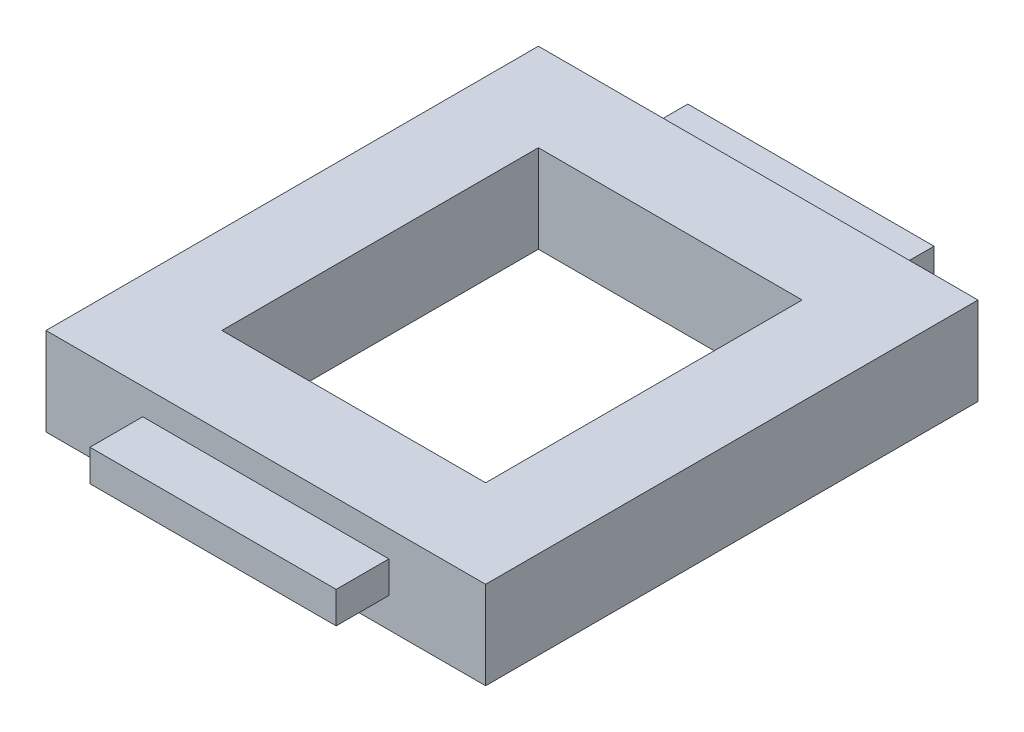
ISO-10303-21;
HEADER;
FILE_DESCRIPTION(('STEP AP214'),'2;1');
FILE_NAME('part.step','',(''),(''),'','','');
FILE_SCHEMA(('AUTOMOTIVE_DESIGN { 1 0 10303 214 1 1 1 1 }'));
ENDSEC;
DATA;
#1=APPLICATION_CONTEXT('core data for automotive mechanical design processes');
#2=APPLICATION_PROTOCOL_DEFINITION('international standard','automotive_design',2000,#1);
#3=PRODUCT_CONTEXT('',#1,'mechanical');
#4=PRODUCT('Part','Part','',(#3));
#5=PRODUCT_RELATED_PRODUCT_CATEGORY('part','',(#4));
#6=PRODUCT_DEFINITION_FORMATION('','',#4);
#7=PRODUCT_DEFINITION_CONTEXT('part definition',#1,'design');
#8=PRODUCT_DEFINITION('design','',#6,#7);
#9=PRODUCT_DEFINITION_SHAPE('','',#8);
#10=(LENGTH_UNIT() NAMED_UNIT(*) SI_UNIT(.MILLI.,.METRE.));
#11=(NAMED_UNIT(*) PLANE_ANGLE_UNIT() SI_UNIT($,.RADIAN.));
#12=(NAMED_UNIT(*) SI_UNIT($,.STERADIAN.) SOLID_ANGLE_UNIT());
#13=UNCERTAINTY_MEASURE_WITH_UNIT(LENGTH_MEASURE(1.E-05),#10,'distance_accuracy_value','');
#14=(GEOMETRIC_REPRESENTATION_CONTEXT(3) GLOBAL_UNCERTAINTY_ASSIGNED_CONTEXT((#13)) GLOBAL_UNIT_ASSIGNED_CONTEXT((#10,
#11,#12)) REPRESENTATION_CONTEXT('',''));
#15=CARTESIAN_POINT('',(0.,0.,0.));
#16=DIRECTION('',(0.,0.,1.));
#17=DIRECTION('',(1.,0.,0.));
#18=AXIS2_PLACEMENT_3D('',#15,#16,#17);
#19=CARTESIAN_POINT('',(0.,5.,-28.));
#20=DIRECTION('',(0.,0.,1.));
#21=DIRECTION('',(1.,0.,0.));
#22=AXIS2_PLACEMENT_3D('',#19,#20,#21);
#23=PLANE('',#22);
#24=DIRECTION('',(-1.,0.,0.));
#25=VECTOR('',#24,1.);
#26=CARTESIAN_POINT('',(0.,0.,-28.));
#27=LINE('',#26,#25);
#28=CARTESIAN_POINT('',(25.,0.,-28.));
#29=VERTEX_POINT('',#28);
#30=CARTESIAN_POINT('',(0.,0.,-28.));
#31=VERTEX_POINT('',#30);
#32=EDGE_CURVE('E240',#29,#31,#27,.T.);
#33=ORIENTED_EDGE('',*,*,#32,.T.);
#34=DIRECTION('',(0.,-1.,0.));
#35=VECTOR('',#34,1.);
#36=CARTESIAN_POINT('',(0.,5.,-28.));
#37=LINE('',#36,#35);
#38=CARTESIAN_POINT('',(0.,5.,-28.));
#39=VERTEX_POINT('',#38);
#40=EDGE_CURVE('E246',#39,#31,#37,.T.);
#41=ORIENTED_EDGE('',*,*,#40,.F.);
#42=DIRECTION('',(-1.,0.,0.));
#43=VECTOR('',#42,1.);
#44=CARTESIAN_POINT('',(0.,5.,-28.));
#45=LINE('',#44,#43);
#46=CARTESIAN_POINT('',(25.,5.,-28.));
#47=VERTEX_POINT('',#46);
#48=EDGE_CURVE('E244',#47,#39,#45,.T.);
#49=ORIENTED_EDGE('',*,*,#48,.F.);
#50=DIRECTION('',(0.,-1.,0.));
#51=VECTOR('',#50,1.);
#52=CARTESIAN_POINT('',(25.,5.,-28.));
#53=LINE('',#52,#51);
#54=EDGE_CURVE('E256',#47,#29,#53,.T.);
#55=ORIENTED_EDGE('',*,*,#54,.T.);
#56=EDGE_LOOP('',(#33,#41,#49,#55));
#57=FACE_BOUND('',#56,.T.);
#58=DIRECTION('',(0.,-1.,0.));
#59=VECTOR('',#58,1.);
#60=CARTESIAN_POINT('',(19.5,3.4,-28.));
#61=LINE('',#60,#59);
#62=CARTESIAN_POINT('',(19.5,3.4,-28.));
#63=VERTEX_POINT('',#62);
#64=CARTESIAN_POINT('',(19.5,1.6,-28.));
#65=VERTEX_POINT('',#64);
#66=EDGE_CURVE('E48',#63,#65,#61,.T.);
#67=ORIENTED_EDGE('',*,*,#66,.F.);
#68=DIRECTION('',(1.,0.,0.));
#69=VECTOR('',#68,1.);
#70=CARTESIAN_POINT('',(19.5,3.4,-28.));
#71=LINE('',#70,#69);
#72=CARTESIAN_POINT('',(5.5,3.4,-28.));
#73=VERTEX_POINT('',#72);
#74=EDGE_CURVE('E52',#73,#63,#71,.T.);
#75=ORIENTED_EDGE('',*,*,#74,.F.);
#76=DIRECTION('',(0.,1.,0.));
#77=VECTOR('',#76,1.);
#78=CARTESIAN_POINT('',(5.5,3.4,-28.));
#79=LINE('',#78,#77);
#80=CARTESIAN_POINT('',(5.5,1.6,-28.));
#81=VERTEX_POINT('',#80);
#82=EDGE_CURVE('E444',#81,#73,#79,.T.);
#83=ORIENTED_EDGE('',*,*,#82,.F.);
#84=DIRECTION('',(-1.,0.,0.));
#85=VECTOR('',#84,1.);
#86=CARTESIAN_POINT('',(19.5,1.6,-28.));
#87=LINE('',#86,#85);
#88=EDGE_CURVE('E450',#65,#81,#87,.T.);
#89=ORIENTED_EDGE('',*,*,#88,.F.);
#90=EDGE_LOOP('',(#67,#75,#83,#89));
#91=FACE_BOUND('',#90,.T.);
#92=ADVANCED_FACE('F33',(#57,#91),#23,.F.);
#93=CARTESIAN_POINT('',(0.,5.,0.));
#94=DIRECTION('',(0.,0.,-1.));
#95=DIRECTION('',(-1.,0.,0.));
#96=AXIS2_PLACEMENT_3D('',#93,#94,#95);
#97=PLANE('',#96);
#98=DIRECTION('',(1.,0.,0.));
#99=VECTOR('',#98,1.);
#100=CARTESIAN_POINT('',(0.,0.,0.));
#101=LINE('',#100,#99);
#102=CARTESIAN_POINT('',(0.,0.,0.));
#103=VERTEX_POINT('',#102);
#104=CARTESIAN_POINT('',(25.,0.,0.));
#105=VERTEX_POINT('',#104);
#106=EDGE_CURVE('E249',#103,#105,#101,.T.);
#107=ORIENTED_EDGE('',*,*,#106,.T.);
#108=DIRECTION('',(0.,-1.,0.));
#109=VECTOR('',#108,1.);
#110=CARTESIAN_POINT('',(25.,5.,0.));
#111=LINE('',#110,#109);
#112=CARTESIAN_POINT('',(25.,5.,0.));
#113=VERTEX_POINT('',#112);
#114=EDGE_CURVE('E41',#113,#105,#111,.T.);
#115=ORIENTED_EDGE('',*,*,#114,.F.);
#116=DIRECTION('',(1.,0.,0.));
#117=VECTOR('',#116,1.);
#118=CARTESIAN_POINT('',(0.,5.,0.));
#119=LINE('',#118,#117);
#120=CARTESIAN_POINT('',(0.,5.,0.));
#121=VERTEX_POINT('',#120);
#122=EDGE_CURVE('E239',#121,#113,#119,.T.);
#123=ORIENTED_EDGE('',*,*,#122,.F.);
#124=DIRECTION('',(0.,-1.,0.));
#125=VECTOR('',#124,1.);
#126=CARTESIAN_POINT('',(0.,5.,0.));
#127=LINE('',#126,#125);
#128=EDGE_CURVE('E11',#121,#103,#127,.T.);
#129=ORIENTED_EDGE('',*,*,#128,.T.);
#130=EDGE_LOOP('',(#107,#115,#123,#129));
#131=FACE_BOUND('',#130,.T.);
#132=DIRECTION('',(0.,-1.,0.));
#133=VECTOR('',#132,1.);
#134=CARTESIAN_POINT('',(5.5,3.5,0.));
#135=LINE('',#134,#133);
#136=CARTESIAN_POINT('',(5.5,3.5,0.));
#137=VERTEX_POINT('',#136);
#138=CARTESIAN_POINT('',(5.5,1.7,0.));
#139=VERTEX_POINT('',#138);
#140=EDGE_CURVE('E166',#137,#139,#135,.T.);
#141=ORIENTED_EDGE('',*,*,#140,.F.);
#142=DIRECTION('',(-1.,0.,0.));
#143=VECTOR('',#142,1.);
#144=CARTESIAN_POINT('',(5.5,3.5,0.));
#145=LINE('',#144,#143);
#146=CARTESIAN_POINT('',(19.5,3.5,0.));
#147=VERTEX_POINT('',#146);
#148=EDGE_CURVE('E179',#147,#137,#145,.T.);
#149=ORIENTED_EDGE('',*,*,#148,.F.);
#150=DIRECTION('',(0.,1.,0.));
#151=VECTOR('',#150,1.);
#152=CARTESIAN_POINT('',(19.5,3.5,0.));
#153=LINE('',#152,#151);
#154=CARTESIAN_POINT('',(19.5,1.7,0.));
#155=VERTEX_POINT('',#154);
#156=EDGE_CURVE('E188',#155,#147,#153,.T.);
#157=ORIENTED_EDGE('',*,*,#156,.F.);
#158=DIRECTION('',(1.,0.,0.));
#159=VECTOR('',#158,1.);
#160=CARTESIAN_POINT('',(5.5,1.7,0.));
#161=LINE('',#160,#159);
#162=EDGE_CURVE('E169',#139,#155,#161,.T.);
#163=ORIENTED_EDGE('',*,*,#162,.F.);
#164=EDGE_LOOP('',(#141,#149,#157,#163));
#165=FACE_BOUND('',#164,.T.);
#166=ADVANCED_FACE('F280',(#131,#165),#97,.F.);
#167=CARTESIAN_POINT('',(0.,5.,0.));
#168=DIRECTION('',(0.,-1.,0.));
#169=DIRECTION('',(0.,0.,-1.));
#170=AXIS2_PLACEMENT_3D('',#167,#168,#169);
#171=PLANE('',#170);
#172=DIRECTION('',(0.,0.,1.));
#173=VECTOR('',#172,1.);
#174=CARTESIAN_POINT('',(0.,5.,0.));
#175=LINE('',#174,#173);
#176=EDGE_CURVE('E236',#39,#121,#175,.T.);
#177=ORIENTED_EDGE('',*,*,#176,.T.);
#178=ORIENTED_EDGE('',*,*,#122,.T.);
#179=DIRECTION('',(0.,0.,-1.));
#180=VECTOR('',#179,1.);
#181=CARTESIAN_POINT('',(25.,5.,0.));
#182=LINE('',#181,#180);
#183=EDGE_CURVE('E242',#113,#47,#182,.T.);
#184=ORIENTED_EDGE('',*,*,#183,.T.);
#185=ORIENTED_EDGE('',*,*,#48,.T.);
#186=EDGE_LOOP('',(#177,#178,#184,#185));
#187=FACE_BOUND('',#186,.T.);
#188=DIRECTION('',(0.,0.,1.));
#189=VECTOR('',#188,1.);
#190=CARTESIAN_POINT('',(5.,5.,-23.));
#191=LINE('',#190,#189);
#192=CARTESIAN_POINT('',(5.,5.,-23.));
#193=VERTEX_POINT('',#192);
#194=CARTESIAN_POINT('',(5.,5.,-5.));
#195=VERTEX_POINT('',#194);
#196=EDGE_CURVE('E205',#193,#195,#191,.T.);
#197=ORIENTED_EDGE('',*,*,#196,.F.);
#198=DIRECTION('',(-1.,0.,0.));
#199=VECTOR('',#198,1.);
#200=CARTESIAN_POINT('',(5.,5.,-23.));
#201=LINE('',#200,#199);
#202=CARTESIAN_POINT('',(20.,5.,-23.));
#203=VERTEX_POINT('',#202);
#204=EDGE_CURVE('E213',#203,#193,#201,.T.);
#205=ORIENTED_EDGE('',*,*,#204,.F.);
#206=DIRECTION('',(0.,0.,-1.));
#207=VECTOR('',#206,1.);
#208=CARTESIAN_POINT('',(20.,5.,-23.));
#209=LINE('',#208,#207);
#210=CARTESIAN_POINT('',(20.,5.,-5.));
#211=VERTEX_POINT('',#210);
#212=EDGE_CURVE('E210',#211,#203,#209,.T.);
#213=ORIENTED_EDGE('',*,*,#212,.F.);
#214=DIRECTION('',(1.,0.,0.));
#215=VECTOR('',#214,1.);
#216=CARTESIAN_POINT('',(5.,5.,-5.));
#217=LINE('',#216,#215);
#218=EDGE_CURVE('E207',#195,#211,#217,.T.);
#219=ORIENTED_EDGE('',*,*,#218,.F.);
#220=EDGE_LOOP('',(#197,#205,#213,#219));
#221=FACE_BOUND('',#220,.T.);
#222=ADVANCED_FACE('F278',(#187,#221),#171,.F.);
#223=CARTESIAN_POINT('',(0.,0.,0.));
#224=DIRECTION('',(0.,-1.,0.));
#225=DIRECTION('',(0.,0.,-1.));
#226=AXIS2_PLACEMENT_3D('',#223,#224,#225);
#227=PLANE('',#226);
#228=DIRECTION('',(0.,0.,1.));
#229=VECTOR('',#228,1.);
#230=CARTESIAN_POINT('',(0.,0.,0.));
#231=LINE('',#230,#229);
#232=EDGE_CURVE('E235',#31,#103,#231,.T.);
#233=ORIENTED_EDGE('',*,*,#232,.F.);
#234=ORIENTED_EDGE('',*,*,#32,.F.);
#235=DIRECTION('',(0.,0.,-1.));
#236=VECTOR('',#235,1.);
#237=CARTESIAN_POINT('',(25.,0.,0.));
#238=LINE('',#237,#236);
#239=EDGE_CURVE('E251',#105,#29,#238,.T.);
#240=ORIENTED_EDGE('',*,*,#239,.F.);
#241=ORIENTED_EDGE('',*,*,#106,.F.);
#242=EDGE_LOOP('',(#233,#234,#240,#241));
#243=FACE_BOUND('',#242,.T.);
#244=DIRECTION('',(-1.,0.,0.));
#245=VECTOR('',#244,1.);
#246=CARTESIAN_POINT('',(5.,0.,-23.));
#247=LINE('',#246,#245);
#248=CARTESIAN_POINT('',(20.,0.,-23.));
#249=VERTEX_POINT('',#248);
#250=CARTESIAN_POINT('',(5.,0.,-23.));
#251=VERTEX_POINT('',#250);
#252=EDGE_CURVE('E208',#249,#251,#247,.T.);
#253=ORIENTED_EDGE('',*,*,#252,.T.);
#254=DIRECTION('',(0.,0.,1.));
#255=VECTOR('',#254,1.);
#256=CARTESIAN_POINT('',(5.,0.,-23.));
#257=LINE('',#256,#255);
#258=CARTESIAN_POINT('',(5.,0.,-5.));
#259=VERTEX_POINT('',#258);
#260=EDGE_CURVE('E204',#251,#259,#257,.T.);
#261=ORIENTED_EDGE('',*,*,#260,.T.);
#262=DIRECTION('',(1.,0.,0.));
#263=VECTOR('',#262,1.);
#264=CARTESIAN_POINT('',(5.,0.,-5.));
#265=LINE('',#264,#263);
#266=CARTESIAN_POINT('',(20.,0.,-5.));
#267=VERTEX_POINT('',#266);
#268=EDGE_CURVE('E218',#259,#267,#265,.T.);
#269=ORIENTED_EDGE('',*,*,#268,.T.);
#270=DIRECTION('',(0.,0.,-1.));
#271=VECTOR('',#270,1.);
#272=CARTESIAN_POINT('',(20.,0.,-23.));
#273=LINE('',#272,#271);
#274=EDGE_CURVE('E221',#267,#249,#273,.T.);
#275=ORIENTED_EDGE('',*,*,#274,.T.);
#276=EDGE_LOOP('',(#253,#261,#269,#275));
#277=FACE_BOUND('',#276,.T.);
#278=ADVANCED_FACE('F269',(#243,#277),#227,.T.);
#279=CARTESIAN_POINT('',(0.,5.,0.));
#280=DIRECTION('',(1.,0.,0.));
#281=DIRECTION('',(0.,0.,-1.));
#282=AXIS2_PLACEMENT_3D('',#279,#280,#281);
#283=PLANE('',#282);
#284=ORIENTED_EDGE('',*,*,#232,.T.);
#285=ORIENTED_EDGE('',*,*,#128,.F.);
#286=ORIENTED_EDGE('',*,*,#176,.F.);
#287=ORIENTED_EDGE('',*,*,#40,.T.);
#288=EDGE_LOOP('',(#284,#285,#286,#287));
#289=FACE_BOUND('',#288,.T.);
#290=ADVANCED_FACE('F35',(#289),#283,.F.);
#291=CARTESIAN_POINT('',(25.,5.,0.));
#292=DIRECTION('',(-1.,0.,0.));
#293=DIRECTION('',(0.,0.,1.));
#294=AXIS2_PLACEMENT_3D('',#291,#292,#293);
#295=PLANE('',#294);
#296=ORIENTED_EDGE('',*,*,#239,.T.);
#297=ORIENTED_EDGE('',*,*,#54,.F.);
#298=ORIENTED_EDGE('',*,*,#183,.F.);
#299=ORIENTED_EDGE('',*,*,#114,.T.);
#300=EDGE_LOOP('',(#296,#297,#298,#299));
#301=FACE_BOUND('',#300,.T.);
#302=ADVANCED_FACE('F263',(#301),#295,.F.);
#303=CARTESIAN_POINT('',(5.,5.,-23.));
#304=DIRECTION('',(1.,0.,0.));
#305=DIRECTION('',(0.,0.,-1.));
#306=AXIS2_PLACEMENT_3D('',#303,#304,#305);
#307=PLANE('',#306);
#308=ORIENTED_EDGE('',*,*,#260,.F.);
#309=DIRECTION('',(0.,-1.,0.));
#310=VECTOR('',#309,1.);
#311=CARTESIAN_POINT('',(5.,5.,-23.));
#312=LINE('',#311,#310);
#313=EDGE_CURVE('E215',#193,#251,#312,.T.);
#314=ORIENTED_EDGE('',*,*,#313,.F.);
#315=ORIENTED_EDGE('',*,*,#196,.T.);
#316=DIRECTION('',(0.,-1.,0.));
#317=VECTOR('',#316,1.);
#318=CARTESIAN_POINT('',(5.,5.,-5.));
#319=LINE('',#318,#317);
#320=EDGE_CURVE('E232',#195,#259,#319,.T.);
#321=ORIENTED_EDGE('',*,*,#320,.T.);
#322=EDGE_LOOP('',(#308,#314,#315,#321));
#323=FACE_BOUND('',#322,.T.);
#324=ADVANCED_FACE('F317',(#323),#307,.T.);
#325=CARTESIAN_POINT('',(5.,5.,-5.));
#326=DIRECTION('',(0.,0.,-1.));
#327=DIRECTION('',(-1.,0.,0.));
#328=AXIS2_PLACEMENT_3D('',#325,#326,#327);
#329=PLANE('',#328);
#330=ORIENTED_EDGE('',*,*,#268,.F.);
#331=ORIENTED_EDGE('',*,*,#320,.F.);
#332=ORIENTED_EDGE('',*,*,#218,.T.);
#333=DIRECTION('',(0.,-1.,0.));
#334=VECTOR('',#333,1.);
#335=CARTESIAN_POINT('',(20.,5.,-5.));
#336=LINE('',#335,#334);
#337=EDGE_CURVE('E230',#211,#267,#336,.T.);
#338=ORIENTED_EDGE('',*,*,#337,.T.);
#339=EDGE_LOOP('',(#330,#331,#332,#338));
#340=FACE_BOUND('',#339,.T.);
#341=ADVANCED_FACE('F322',(#340),#329,.T.);
#342=CARTESIAN_POINT('',(20.,5.,-23.));
#343=DIRECTION('',(-1.,0.,0.));
#344=DIRECTION('',(0.,0.,1.));
#345=AXIS2_PLACEMENT_3D('',#342,#343,#344);
#346=PLANE('',#345);
#347=ORIENTED_EDGE('',*,*,#274,.F.);
#348=ORIENTED_EDGE('',*,*,#337,.F.);
#349=ORIENTED_EDGE('',*,*,#212,.T.);
#350=DIRECTION('',(0.,-1.,0.));
#351=VECTOR('',#350,1.);
#352=CARTESIAN_POINT('',(20.,5.,-23.));
#353=LINE('',#352,#351);
#354=EDGE_CURVE('E228',#203,#249,#353,.T.);
#355=ORIENTED_EDGE('',*,*,#354,.T.);
#356=EDGE_LOOP('',(#347,#348,#349,#355));
#357=FACE_BOUND('',#356,.T.);
#358=ADVANCED_FACE('F336',(#357),#346,.T.);
#359=CARTESIAN_POINT('',(5.,5.,-23.));
#360=DIRECTION('',(0.,0.,1.));
#361=DIRECTION('',(1.,0.,0.));
#362=AXIS2_PLACEMENT_3D('',#359,#360,#361);
#363=PLANE('',#362);
#364=ORIENTED_EDGE('',*,*,#252,.F.);
#365=ORIENTED_EDGE('',*,*,#354,.F.);
#366=ORIENTED_EDGE('',*,*,#204,.T.);
#367=ORIENTED_EDGE('',*,*,#313,.T.);
#368=EDGE_LOOP('',(#364,#365,#366,#367));
#369=FACE_BOUND('',#368,.T.);
#370=ADVANCED_FACE('F307',(#369),#363,.T.);
#371=CARTESIAN_POINT('',(5.5,3.5,3.));
#372=DIRECTION('',(1.,0.,0.));
#373=DIRECTION('',(0.,0.,-1.));
#374=AXIS2_PLACEMENT_3D('',#371,#372,#373);
#375=PLANE('',#374);
#376=ORIENTED_EDGE('',*,*,#140,.T.);
#377=DIRECTION('',(0.,0.,-1.));
#378=VECTOR('',#377,1.);
#379=CARTESIAN_POINT('',(5.5,1.7,3.));
#380=LINE('',#379,#378);
#381=CARTESIAN_POINT('',(5.5,1.7,3.));
#382=VERTEX_POINT('',#381);
#383=EDGE_CURVE('E201',#382,#139,#380,.T.);
#384=ORIENTED_EDGE('',*,*,#383,.F.);
#385=DIRECTION('',(0.,-1.,0.));
#386=VECTOR('',#385,1.);
#387=CARTESIAN_POINT('',(5.5,3.5,3.));
#388=LINE('',#387,#386);
#389=CARTESIAN_POINT('',(5.5,3.5,3.));
#390=VERTEX_POINT('',#389);
#391=EDGE_CURVE('E175',#390,#382,#388,.T.);
#392=ORIENTED_EDGE('',*,*,#391,.F.);
#393=DIRECTION('',(0.,0.,-1.));
#394=VECTOR('',#393,1.);
#395=CARTESIAN_POINT('',(5.5,3.5,3.));
#396=LINE('',#395,#394);
#397=EDGE_CURVE('E184',#390,#137,#396,.T.);
#398=ORIENTED_EDGE('',*,*,#397,.T.);
#399=EDGE_LOOP('',(#376,#384,#392,#398));
#400=FACE_BOUND('',#399,.T.);
#401=ADVANCED_FACE('F291',(#400),#375,.F.);
#402=CARTESIAN_POINT('',(5.5,1.7,3.));
#403=DIRECTION('',(0.,1.,0.));
#404=DIRECTION('',(0.,0.,1.));
#405=AXIS2_PLACEMENT_3D('',#402,#403,#404);
#406=PLANE('',#405);
#407=ORIENTED_EDGE('',*,*,#162,.T.);
#408=DIRECTION('',(0.,0.,-1.));
#409=VECTOR('',#408,1.);
#410=CARTESIAN_POINT('',(19.5,1.7,3.));
#411=LINE('',#410,#409);
#412=CARTESIAN_POINT('',(19.5,1.7,3.));
#413=VERTEX_POINT('',#412);
#414=EDGE_CURVE('E198',#413,#155,#411,.T.);
#415=ORIENTED_EDGE('',*,*,#414,.F.);
#416=DIRECTION('',(1.,0.,0.));
#417=VECTOR('',#416,1.);
#418=CARTESIAN_POINT('',(5.5,1.7,3.));
#419=LINE('',#418,#417);
#420=EDGE_CURVE('E178',#382,#413,#419,.T.);
#421=ORIENTED_EDGE('',*,*,#420,.F.);
#422=ORIENTED_EDGE('',*,*,#383,.T.);
#423=EDGE_LOOP('',(#407,#415,#421,#422));
#424=FACE_BOUND('',#423,.T.);
#425=ADVANCED_FACE('F299',(#424),#406,.F.);
#426=CARTESIAN_POINT('',(19.5,3.5,3.));
#427=DIRECTION('',(-1.,0.,0.));
#428=DIRECTION('',(0.,0.,1.));
#429=AXIS2_PLACEMENT_3D('',#426,#427,#428);
#430=PLANE('',#429);
#431=ORIENTED_EDGE('',*,*,#156,.T.);
#432=DIRECTION('',(0.,0.,-1.));
#433=VECTOR('',#432,1.);
#434=CARTESIAN_POINT('',(19.5,3.5,3.));
#435=LINE('',#434,#433);
#436=CARTESIAN_POINT('',(19.5,3.5,3.));
#437=VERTEX_POINT('',#436);
#438=EDGE_CURVE('E195',#437,#147,#435,.T.);
#439=ORIENTED_EDGE('',*,*,#438,.F.);
#440=DIRECTION('',(0.,1.,0.));
#441=VECTOR('',#440,1.);
#442=CARTESIAN_POINT('',(19.5,3.5,3.));
#443=LINE('',#442,#441);
#444=EDGE_CURVE('E181',#413,#437,#443,.T.);
#445=ORIENTED_EDGE('',*,*,#444,.F.);
#446=ORIENTED_EDGE('',*,*,#414,.T.);
#447=EDGE_LOOP('',(#431,#439,#445,#446));
#448=FACE_BOUND('',#447,.T.);
#449=ADVANCED_FACE('F297',(#448),#430,.F.);
#450=CARTESIAN_POINT('',(5.5,3.5,3.));
#451=DIRECTION('',(0.,-1.,0.));
#452=DIRECTION('',(0.,0.,-1.));
#453=AXIS2_PLACEMENT_3D('',#450,#451,#452);
#454=PLANE('',#453);
#455=ORIENTED_EDGE('',*,*,#148,.T.);
#456=ORIENTED_EDGE('',*,*,#397,.F.);
#457=DIRECTION('',(-1.,0.,0.));
#458=VECTOR('',#457,1.);
#459=CARTESIAN_POINT('',(5.5,3.5,3.));
#460=LINE('',#459,#458);
#461=EDGE_CURVE('E183',#437,#390,#460,.T.);
#462=ORIENTED_EDGE('',*,*,#461,.F.);
#463=ORIENTED_EDGE('',*,*,#438,.T.);
#464=EDGE_LOOP('',(#455,#456,#462,#463));
#465=FACE_BOUND('',#464,.T.);
#466=ADVANCED_FACE('F287',(#465),#454,.F.);
#467=CARTESIAN_POINT('',(0.,0.,3.));
#468=DIRECTION('',(0.,0.,1.));
#469=DIRECTION('',(1.,0.,0.));
#470=AXIS2_PLACEMENT_3D('',#467,#468,#469);
#471=PLANE('',#470);
#472=ORIENTED_EDGE('',*,*,#391,.T.);
#473=ORIENTED_EDGE('',*,*,#420,.T.);
#474=ORIENTED_EDGE('',*,*,#444,.T.);
#475=ORIENTED_EDGE('',*,*,#461,.T.);
#476=EDGE_LOOP('',(#472,#473,#474,#475));
#477=FACE_BOUND('',#476,.T.);
#478=ADVANCED_FACE('F293',(#477),#471,.T.);
#479=CARTESIAN_POINT('',(19.5,3.4,-31.));
#480=DIRECTION('',(-1.,0.,0.));
#481=DIRECTION('',(0.,0.,1.));
#482=AXIS2_PLACEMENT_3D('',#479,#480,#481);
#483=PLANE('',#482);
#484=ORIENTED_EDGE('',*,*,#66,.T.);
#485=DIRECTION('',(0.,0.,1.));
#486=VECTOR('',#485,1.);
#487=CARTESIAN_POINT('',(19.5,1.6,-31.));
#488=LINE('',#487,#486);
#489=CARTESIAN_POINT('',(19.5,1.6,-31.));
#490=VERTEX_POINT('',#489);
#491=EDGE_CURVE('E149',#490,#65,#488,.T.);
#492=ORIENTED_EDGE('',*,*,#491,.F.);
#493=DIRECTION('',(0.,-1.,0.));
#494=VECTOR('',#493,1.);
#495=CARTESIAN_POINT('',(19.5,3.4,-31.));
#496=LINE('',#495,#494);
#497=CARTESIAN_POINT('',(19.5,3.4,-31.));
#498=VERTEX_POINT('',#497);
#499=EDGE_CURVE('E155',#498,#490,#496,.T.);
#500=ORIENTED_EDGE('',*,*,#499,.F.);
#501=DIRECTION('',(0.,0.,1.));
#502=VECTOR('',#501,1.);
#503=CARTESIAN_POINT('',(19.5,3.4,-31.));
#504=LINE('',#503,#502);
#505=EDGE_CURVE('E442',#498,#63,#504,.T.);
#506=ORIENTED_EDGE('',*,*,#505,.T.);
#507=EDGE_LOOP('',(#484,#492,#500,#506));
#508=FACE_BOUND('',#507,.T.);
#509=ADVANCED_FACE('F165',(#508),#483,.F.);
#510=CARTESIAN_POINT('',(19.5,1.6,-31.));
#511=DIRECTION('',(0.,1.,0.));
#512=DIRECTION('',(0.,0.,1.));
#513=AXIS2_PLACEMENT_3D('',#510,#511,#512);
#514=PLANE('',#513);
#515=ORIENTED_EDGE('',*,*,#88,.T.);
#516=DIRECTION('',(0.,0.,1.));
#517=VECTOR('',#516,1.);
#518=CARTESIAN_POINT('',(5.5,1.6,-31.));
#519=LINE('',#518,#517);
#520=CARTESIAN_POINT('',(5.5,1.6,-31.));
#521=VERTEX_POINT('',#520);
#522=EDGE_CURVE('E151',#521,#81,#519,.T.);
#523=ORIENTED_EDGE('',*,*,#522,.F.);
#524=DIRECTION('',(-1.,0.,0.));
#525=VECTOR('',#524,1.);
#526=CARTESIAN_POINT('',(19.5,1.6,-31.));
#527=LINE('',#526,#525);
#528=EDGE_CURVE('E144',#490,#521,#527,.T.);
#529=ORIENTED_EDGE('',*,*,#528,.F.);
#530=ORIENTED_EDGE('',*,*,#491,.T.);
#531=EDGE_LOOP('',(#515,#523,#529,#530));
#532=FACE_BOUND('',#531,.T.);
#533=ADVANCED_FACE('F147',(#532),#514,.F.);
#534=CARTESIAN_POINT('',(5.5,3.4,-31.));
#535=DIRECTION('',(1.,0.,0.));
#536=DIRECTION('',(0.,0.,-1.));
#537=AXIS2_PLACEMENT_3D('',#534,#535,#536);
#538=PLANE('',#537);
#539=ORIENTED_EDGE('',*,*,#82,.T.);
#540=DIRECTION('',(0.,0.,1.));
#541=VECTOR('',#540,1.);
#542=CARTESIAN_POINT('',(5.5,3.4,-31.));
#543=LINE('',#542,#541);
#544=CARTESIAN_POINT('',(5.5,3.4,-31.));
#545=VERTEX_POINT('',#544);
#546=EDGE_CURVE('E171',#545,#73,#543,.T.);
#547=ORIENTED_EDGE('',*,*,#546,.F.);
#548=DIRECTION('',(0.,1.,0.));
#549=VECTOR('',#548,1.);
#550=CARTESIAN_POINT('',(5.5,3.4,-31.));
#551=LINE('',#550,#549);
#552=EDGE_CURVE('E154',#521,#545,#551,.T.);
#553=ORIENTED_EDGE('',*,*,#552,.F.);
#554=ORIENTED_EDGE('',*,*,#522,.T.);
#555=EDGE_LOOP('',(#539,#547,#553,#554));
#556=FACE_BOUND('',#555,.T.);
#557=ADVANCED_FACE('F410',(#556),#538,.F.);
#558=CARTESIAN_POINT('',(19.5,3.4,-31.));
#559=DIRECTION('',(0.,-1.,0.));
#560=DIRECTION('',(0.,0.,-1.));
#561=AXIS2_PLACEMENT_3D('',#558,#559,#560);
#562=PLANE('',#561);
#563=ORIENTED_EDGE('',*,*,#74,.T.);
#564=ORIENTED_EDGE('',*,*,#505,.F.);
#565=DIRECTION('',(1.,0.,0.));
#566=VECTOR('',#565,1.);
#567=CARTESIAN_POINT('',(19.5,3.4,-31.));
#568=LINE('',#567,#566);
#569=EDGE_CURVE('E160',#545,#498,#568,.T.);
#570=ORIENTED_EDGE('',*,*,#569,.F.);
#571=ORIENTED_EDGE('',*,*,#546,.T.);
#572=EDGE_LOOP('',(#563,#564,#570,#571));
#573=FACE_BOUND('',#572,.T.);
#574=ADVANCED_FACE('F419',(#573),#562,.F.);
#575=CARTESIAN_POINT('',(0.,0.,-31.));
#576=DIRECTION('',(0.,0.,-1.));
#577=DIRECTION('',(-1.,0.,0.));
#578=AXIS2_PLACEMENT_3D('',#575,#576,#577);
#579=PLANE('',#578);
#580=ORIENTED_EDGE('',*,*,#499,.T.);
#581=ORIENTED_EDGE('',*,*,#528,.T.);
#582=ORIENTED_EDGE('',*,*,#552,.T.);
#583=ORIENTED_EDGE('',*,*,#569,.T.);
#584=EDGE_LOOP('',(#580,#581,#582,#583));
#585=FACE_BOUND('',#584,.T.);
#586=ADVANCED_FACE('F158',(#585),#579,.T.);
#587=CLOSED_SHELL('',(#92,#166,#222,#278,#290,#302,#324,#341,#358,#370,#401,#425,#449,#466,#478,
#509,#533,#557,#574,#586));
#588=MANIFOLD_SOLID_BREP('B2',#587);
#589=ADVANCED_BREP_SHAPE_REPRESENTATION('',(#18,#588),#14);
#590=SHAPE_DEFINITION_REPRESENTATION(#9,#589);
ENDSEC;
END-ISO-10303-21;
